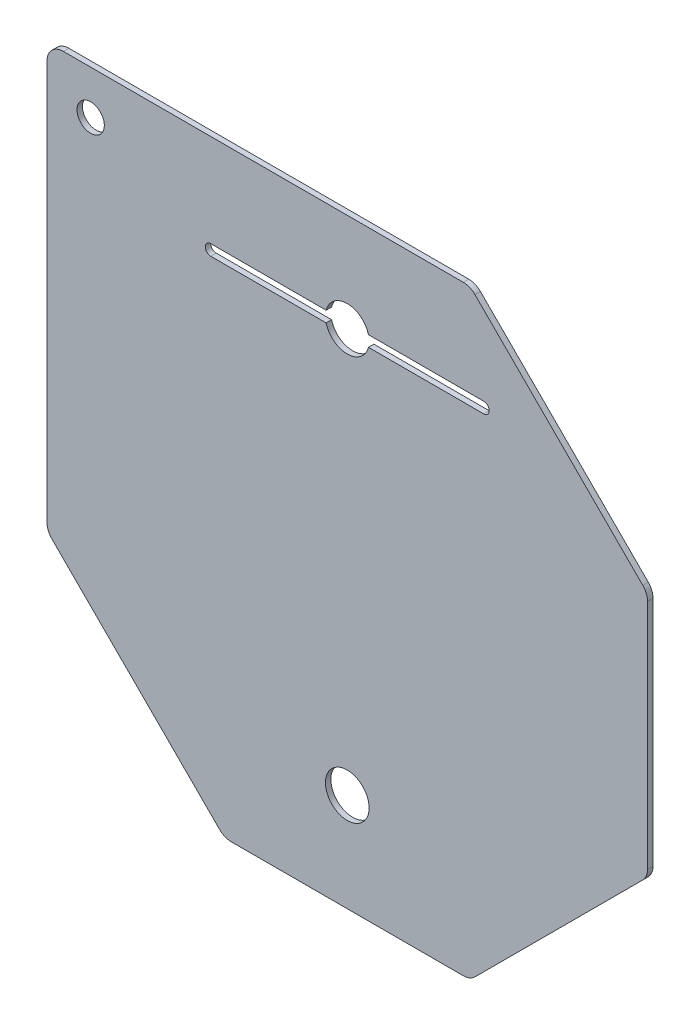
ISO-10303-21;
HEADER;
FILE_DESCRIPTION(('STEP AP214'),'2;1');
FILE_NAME('part.step','',(''),(''),'','','');
FILE_SCHEMA(('AUTOMOTIVE_DESIGN { 1 0 10303 214 1 1 1 1 }'));
ENDSEC;
DATA;
#1=APPLICATION_CONTEXT('core data for automotive mechanical design processes');
#2=APPLICATION_PROTOCOL_DEFINITION('international standard','automotive_design',2000,#1);
#3=PRODUCT_CONTEXT('',#1,'mechanical');
#4=PRODUCT('Part','Part','',(#3));
#5=PRODUCT_RELATED_PRODUCT_CATEGORY('part','',(#4));
#6=PRODUCT_DEFINITION_FORMATION('','',#4);
#7=PRODUCT_DEFINITION_CONTEXT('part definition',#1,'design');
#8=PRODUCT_DEFINITION('design','',#6,#7);
#9=PRODUCT_DEFINITION_SHAPE('','',#8);
#10=(LENGTH_UNIT() NAMED_UNIT(*) SI_UNIT(.MILLI.,.METRE.));
#11=(NAMED_UNIT(*) PLANE_ANGLE_UNIT() SI_UNIT($,.RADIAN.));
#12=(NAMED_UNIT(*) SI_UNIT($,.STERADIAN.) SOLID_ANGLE_UNIT());
#13=UNCERTAINTY_MEASURE_WITH_UNIT(LENGTH_MEASURE(1.E-05),#10,'distance_accuracy_value','');
#14=(GEOMETRIC_REPRESENTATION_CONTEXT(3) GLOBAL_UNCERTAINTY_ASSIGNED_CONTEXT((#13)) GLOBAL_UNIT_ASSIGNED_CONTEXT((#10,
#11,#12)) REPRESENTATION_CONTEXT('',''));
#15=CARTESIAN_POINT('',(0.,0.,0.));
#16=DIRECTION('',(0.,0.,1.));
#17=DIRECTION('',(1.,0.,0.));
#18=AXIS2_PLACEMENT_3D('',#15,#16,#17);
#19=CARTESIAN_POINT('',(-52.,52.,1.));
#20=DIRECTION('',(0.,0.,-1.));
#21=DIRECTION('',(-1.,0.,0.));
#22=AXIS2_PLACEMENT_3D('',#19,#20,#21);
#23=PLANE('',#22);
#24=CARTESIAN_POINT('',(-47.,47.,1.));
#25=DIRECTION('',(0.,0.,1.));
#26=DIRECTION('',(1.,0.,0.));
#27=AXIS2_PLACEMENT_3D('',#24,#25,#26);
#28=CIRCLE('',#27,2.5);
#29=CARTESIAN_POINT('',(-44.5,47.,1.));
#30=VERTEX_POINT('',#29);
#31=EDGE_CURVE('E250',#30,#30,#28,.T.);
#32=ORIENTED_EDGE('',*,*,#31,.F.);
#33=EDGE_LOOP('',(#32));
#34=FACE_BOUND('',#33,.T.);
#35=CARTESIAN_POINT('',(-52.,52.,1.));
#36=DIRECTION('',(0.,0.,1.));
#37=DIRECTION('',(-1.,0.,0.));
#38=AXIS2_PLACEMENT_3D('',#35,#36,#37);
#39=CIRCLE('',#38,3.);
#40=CARTESIAN_POINT('',(-52.,55.,1.));
#41=VERTEX_POINT('',#40);
#42=CARTESIAN_POINT('',(-55.,52.,1.));
#43=VERTEX_POINT('',#42);
#44=EDGE_CURVE('E256',#41,#43,#39,.T.);
#45=ORIENTED_EDGE('',*,*,#44,.T.);
#46=DIRECTION('',(0.,-1.,0.));
#47=VECTOR('',#46,1.);
#48=CARTESIAN_POINT('',(-55.,-21.2573593128807,1.));
#49=LINE('',#48,#47);
#50=CARTESIAN_POINT('',(-55.,-21.2573593128807,1.));
#51=VERTEX_POINT('',#50);
#52=EDGE_CURVE('E259',#43,#51,#49,.T.);
#53=ORIENTED_EDGE('',*,*,#52,.T.);
#54=CARTESIAN_POINT('',(-52.,-21.2573593128807,1.));
#55=DIRECTION('',(0.,0.,1.));
#56=DIRECTION('',(-1.,0.,0.));
#57=AXIS2_PLACEMENT_3D('',#54,#55,#56);
#58=CIRCLE('',#57,3.);
#59=CARTESIAN_POINT('',(-54.1213203435596,-23.3786796564404,1.));
#60=VERTEX_POINT('',#59);
#61=EDGE_CURVE('E262',#51,#60,#58,.T.);
#62=ORIENTED_EDGE('',*,*,#61,.T.);
#63=DIRECTION('',(0.707106781186548,-0.707106781186547,0.));
#64=VECTOR('',#63,1.);
#65=CARTESIAN_POINT('',(-54.1213203435596,-23.3786796564404,1.));
#66=LINE('',#65,#64);
#67=CARTESIAN_POINT('',(-23.3786796564404,-54.1213203435596,1.));
#68=VERTEX_POINT('',#67);
#69=EDGE_CURVE('E264',#60,#68,#66,.T.);
#70=ORIENTED_EDGE('',*,*,#69,.T.);
#71=CARTESIAN_POINT('',(-21.2573593128807,-52.,1.));
#72=DIRECTION('',(0.,0.,1.));
#73=DIRECTION('',(-1.,0.,0.));
#74=AXIS2_PLACEMENT_3D('',#71,#72,#73);
#75=CIRCLE('',#74,2.99999999999999);
#76=CARTESIAN_POINT('',(-21.2573593128807,-55.,1.));
#77=VERTEX_POINT('',#76);
#78=EDGE_CURVE('E266',#68,#77,#75,.T.);
#79=ORIENTED_EDGE('',*,*,#78,.T.);
#80=DIRECTION('',(1.,0.,0.));
#81=VECTOR('',#80,1.);
#82=CARTESIAN_POINT('',(-21.2573593128807,-55.,1.));
#83=LINE('',#82,#81);
#84=CARTESIAN_POINT('',(21.2573593128807,-55.,1.));
#85=VERTEX_POINT('',#84);
#86=EDGE_CURVE('E268',#77,#85,#83,.T.);
#87=ORIENTED_EDGE('',*,*,#86,.T.);
#88=CARTESIAN_POINT('',(21.2573593128807,-52.,1.));
#89=DIRECTION('',(0.,0.,1.));
#90=DIRECTION('',(-1.,0.,0.));
#91=AXIS2_PLACEMENT_3D('',#88,#89,#90);
#92=CIRCLE('',#91,3.);
#93=CARTESIAN_POINT('',(23.3786796564404,-54.1213203435596,1.));
#94=VERTEX_POINT('',#93);
#95=EDGE_CURVE('E270',#85,#94,#92,.T.);
#96=ORIENTED_EDGE('',*,*,#95,.T.);
#97=DIRECTION('',(0.707106781186548,0.707106781186547,0.));
#98=VECTOR('',#97,1.);
#99=CARTESIAN_POINT('',(23.3786796564404,-54.1213203435596,1.));
#100=LINE('',#99,#98);
#101=CARTESIAN_POINT('',(54.1213203435596,-23.3786796564404,1.));
#102=VERTEX_POINT('',#101);
#103=EDGE_CURVE('E272',#94,#102,#100,.T.);
#104=ORIENTED_EDGE('',*,*,#103,.T.);
#105=CARTESIAN_POINT('',(52.,-21.2573593128807,1.));
#106=DIRECTION('',(0.,0.,1.));
#107=DIRECTION('',(1.,0.,0.));
#108=AXIS2_PLACEMENT_3D('',#105,#106,#107);
#109=CIRCLE('',#108,3.);
#110=CARTESIAN_POINT('',(55.,-21.2573593128807,1.));
#111=VERTEX_POINT('',#110);
#112=EDGE_CURVE('E274',#102,#111,#109,.T.);
#113=ORIENTED_EDGE('',*,*,#112,.T.);
#114=DIRECTION('',(0.,1.,0.));
#115=VECTOR('',#114,1.);
#116=CARTESIAN_POINT('',(55.,-21.2573593128807,1.));
#117=LINE('',#116,#115);
#118=CARTESIAN_POINT('',(55.,21.2573593128807,1.));
#119=VERTEX_POINT('',#118);
#120=EDGE_CURVE('E276',#111,#119,#117,.T.);
#121=ORIENTED_EDGE('',*,*,#120,.T.);
#122=CARTESIAN_POINT('',(52.,21.2573593128807,1.));
#123=DIRECTION('',(0.,0.,1.));
#124=DIRECTION('',(-1.,0.,0.));
#125=AXIS2_PLACEMENT_3D('',#122,#123,#124);
#126=CIRCLE('',#125,3.);
#127=CARTESIAN_POINT('',(54.1213203435596,23.3786796564404,1.));
#128=VERTEX_POINT('',#127);
#129=EDGE_CURVE('E278',#119,#128,#126,.T.);
#130=ORIENTED_EDGE('',*,*,#129,.T.);
#131=DIRECTION('',(-0.707106781186548,0.707106781186547,0.));
#132=VECTOR('',#131,1.);
#133=CARTESIAN_POINT('',(54.1213203435596,23.3786796564404,1.));
#134=LINE('',#133,#132);
#135=CARTESIAN_POINT('',(23.3786796564404,54.1213203435596,1.));
#136=VERTEX_POINT('',#135);
#137=EDGE_CURVE('E280',#128,#136,#134,.T.);
#138=ORIENTED_EDGE('',*,*,#137,.T.);
#139=CARTESIAN_POINT('',(21.2573593128807,52.,1.));
#140=DIRECTION('',(0.,0.,1.));
#141=DIRECTION('',(-1.,0.,0.));
#142=AXIS2_PLACEMENT_3D('',#139,#140,#141);
#143=CIRCLE('',#142,3.);
#144=CARTESIAN_POINT('',(21.2573593128807,55.,1.));
#145=VERTEX_POINT('',#144);
#146=EDGE_CURVE('E282',#136,#145,#143,.T.);
#147=ORIENTED_EDGE('',*,*,#146,.T.);
#148=DIRECTION('',(-1.,0.,0.));
#149=VECTOR('',#148,1.);
#150=CARTESIAN_POINT('',(-52.,55.,1.));
#151=LINE('',#150,#149);
#152=EDGE_CURVE('E284',#145,#41,#151,.T.);
#153=ORIENTED_EDGE('',*,*,#152,.T.);
#154=EDGE_LOOP('',(#45,#53,#62,#70,#79,#87,#96,#104,#113,#121,#130,#138,#147,#153));
#155=FACE_BOUND('',#154,.T.);
#156=CARTESIAN_POINT('',(0.,37.,1.));
#157=DIRECTION('',(0.,0.,1.));
#158=DIRECTION('',(1.,0.,0.));
#159=AXIS2_PLACEMENT_3D('',#156,#157,#158);
#160=CIRCLE('',#159,4.);
#161=CARTESIAN_POINT('',(-3.87298334620742,36.,1.));
#162=VERTEX_POINT('',#161);
#163=CARTESIAN_POINT('',(3.87298334620742,36.,1.));
#164=VERTEX_POINT('',#163);
#165=EDGE_CURVE('E182',#162,#164,#160,.T.);
#166=ORIENTED_EDGE('',*,*,#165,.F.);
#167=DIRECTION('',(1.,0.,0.));
#168=VECTOR('',#167,1.);
#169=CARTESIAN_POINT('',(-25.,36.,1.));
#170=LINE('',#169,#168);
#171=CARTESIAN_POINT('',(-25.,36.,1.));
#172=VERTEX_POINT('',#171);
#173=EDGE_CURVE('E217',#172,#162,#170,.T.);
#174=ORIENTED_EDGE('',*,*,#173,.F.);
#175=CARTESIAN_POINT('',(-25.,37.,1.));
#176=DIRECTION('',(0.,0.,1.));
#177=DIRECTION('',(1.,0.,0.));
#178=AXIS2_PLACEMENT_3D('',#175,#176,#177);
#179=CIRCLE('',#178,0.999999999999994);
#180=CARTESIAN_POINT('',(-25.,38.,1.));
#181=VERTEX_POINT('',#180);
#182=EDGE_CURVE('E215',#181,#172,#179,.T.);
#183=ORIENTED_EDGE('',*,*,#182,.F.);
#184=DIRECTION('',(-1.,0.,0.));
#185=VECTOR('',#184,1.);
#186=CARTESIAN_POINT('',(-25.,38.,1.));
#187=LINE('',#186,#185);
#188=CARTESIAN_POINT('',(-3.87298334620742,38.,1.));
#189=VERTEX_POINT('',#188);
#190=EDGE_CURVE('E213',#189,#181,#187,.T.);
#191=ORIENTED_EDGE('',*,*,#190,.F.);
#192=CARTESIAN_POINT('',(0.,37.,1.));
#193=DIRECTION('',(0.,0.,1.));
#194=DIRECTION('',(1.,0.,0.));
#195=AXIS2_PLACEMENT_3D('',#192,#193,#194);
#196=CIRCLE('',#195,4.);
#197=CARTESIAN_POINT('',(3.87298334620742,38.,1.));
#198=VERTEX_POINT('',#197);
#199=EDGE_CURVE('E211',#198,#189,#196,.T.);
#200=ORIENTED_EDGE('',*,*,#199,.F.);
#201=DIRECTION('',(-1.,0.,0.));
#202=VECTOR('',#201,1.);
#203=CARTESIAN_POINT('',(3.87298334620742,38.,1.));
#204=LINE('',#203,#202);
#205=CARTESIAN_POINT('',(25.,38.,1.));
#206=VERTEX_POINT('',#205);
#207=EDGE_CURVE('E206',#206,#198,#204,.T.);
#208=ORIENTED_EDGE('',*,*,#207,.F.);
#209=CARTESIAN_POINT('',(25.,37.,1.));
#210=DIRECTION('',(0.,0.,1.));
#211=DIRECTION('',(1.,0.,0.));
#212=AXIS2_PLACEMENT_3D('',#209,#210,#211);
#213=CIRCLE('',#212,0.999999999999994);
#214=CARTESIAN_POINT('',(25.,36.,1.));
#215=VERTEX_POINT('',#214);
#216=EDGE_CURVE('E204',#215,#206,#213,.T.);
#217=ORIENTED_EDGE('',*,*,#216,.F.);
#218=DIRECTION('',(1.,0.,0.));
#219=VECTOR('',#218,1.);
#220=CARTESIAN_POINT('',(3.87298334620742,36.,1.));
#221=LINE('',#220,#219);
#222=EDGE_CURVE('E190',#164,#215,#221,.T.);
#223=ORIENTED_EDGE('',*,*,#222,.F.);
#224=EDGE_LOOP('',(#166,#174,#183,#191,#200,#208,#217,#223));
#225=FACE_BOUND('',#224,.T.);
#226=CARTESIAN_POINT('',(0.,-37.,1.));
#227=DIRECTION('',(0.,0.,1.));
#228=DIRECTION('',(1.,0.,0.));
#229=AXIS2_PLACEMENT_3D('',#226,#227,#228);
#230=CIRCLE('',#229,4.);
#231=CARTESIAN_POINT('',(4.,-37.,1.));
#232=VERTEX_POINT('',#231);
#233=EDGE_CURVE('E220',#232,#232,#230,.T.);
#234=ORIENTED_EDGE('',*,*,#233,.F.);
#235=EDGE_LOOP('',(#234));
#236=FACE_BOUND('',#235,.T.);
#237=ADVANCED_FACE('F33',(#34,#155,#225,#236),#23,.F.);
#238=CARTESIAN_POINT('',(-52.,52.,0.));
#239=DIRECTION('',(0.,0.,-1.));
#240=DIRECTION('',(-1.,0.,0.));
#241=AXIS2_PLACEMENT_3D('',#238,#239,#240);
#242=PLANE('',#241);
#243=DIRECTION('',(1.,0.,0.));
#244=VECTOR('',#243,1.);
#245=CARTESIAN_POINT('',(-25.,36.,0.));
#246=LINE('',#245,#244);
#247=CARTESIAN_POINT('',(-25.,36.,0.));
#248=VERTEX_POINT('',#247);
#249=CARTESIAN_POINT('',(-3.87298334620742,36.,0.));
#250=VERTEX_POINT('',#249);
#251=EDGE_CURVE('E191',#248,#250,#246,.T.);
#252=ORIENTED_EDGE('',*,*,#251,.T.);
#253=CARTESIAN_POINT('',(0.,37.,0.));
#254=DIRECTION('',(0.,0.,1.));
#255=DIRECTION('',(1.,0.,0.));
#256=AXIS2_PLACEMENT_3D('',#253,#254,#255);
#257=CIRCLE('',#256,4.);
#258=CARTESIAN_POINT('',(3.87298334620742,36.,0.));
#259=VERTEX_POINT('',#258);
#260=EDGE_CURVE('E56',#250,#259,#257,.T.);
#261=ORIENTED_EDGE('',*,*,#260,.T.);
#262=DIRECTION('',(1.,0.,0.));
#263=VECTOR('',#262,1.);
#264=CARTESIAN_POINT('',(3.87298334620742,36.,0.));
#265=LINE('',#264,#263);
#266=CARTESIAN_POINT('',(25.,36.,0.));
#267=VERTEX_POINT('',#266);
#268=EDGE_CURVE('E197',#259,#267,#265,.T.);
#269=ORIENTED_EDGE('',*,*,#268,.T.);
#270=CARTESIAN_POINT('',(25.,37.,0.));
#271=DIRECTION('',(0.,0.,1.));
#272=DIRECTION('',(1.,0.,0.));
#273=AXIS2_PLACEMENT_3D('',#270,#271,#272);
#274=CIRCLE('',#273,0.999999999999994);
#275=CARTESIAN_POINT('',(25.,38.,0.));
#276=VERTEX_POINT('',#275);
#277=EDGE_CURVE('E222',#267,#276,#274,.T.);
#278=ORIENTED_EDGE('',*,*,#277,.T.);
#279=DIRECTION('',(-1.,0.,0.));
#280=VECTOR('',#279,1.);
#281=CARTESIAN_POINT('',(3.87298334620742,38.,0.));
#282=LINE('',#281,#280);
#283=CARTESIAN_POINT('',(3.87298334620742,38.,0.));
#284=VERTEX_POINT('',#283);
#285=EDGE_CURVE('E225',#276,#284,#282,.T.);
#286=ORIENTED_EDGE('',*,*,#285,.T.);
#287=CARTESIAN_POINT('',(0.,37.,0.));
#288=DIRECTION('',(0.,0.,1.));
#289=DIRECTION('',(1.,0.,0.));
#290=AXIS2_PLACEMENT_3D('',#287,#288,#289);
#291=CIRCLE('',#290,4.);
#292=CARTESIAN_POINT('',(-3.87298334620742,38.,0.));
#293=VERTEX_POINT('',#292);
#294=EDGE_CURVE('E228',#284,#293,#291,.T.);
#295=ORIENTED_EDGE('',*,*,#294,.T.);
#296=DIRECTION('',(-1.,0.,0.));
#297=VECTOR('',#296,1.);
#298=CARTESIAN_POINT('',(-25.,38.,0.));
#299=LINE('',#298,#297);
#300=CARTESIAN_POINT('',(-25.,38.,0.));
#301=VERTEX_POINT('',#300);
#302=EDGE_CURVE('E231',#293,#301,#299,.T.);
#303=ORIENTED_EDGE('',*,*,#302,.T.);
#304=CARTESIAN_POINT('',(-25.,37.,0.));
#305=DIRECTION('',(0.,0.,1.));
#306=DIRECTION('',(1.,0.,0.));
#307=AXIS2_PLACEMENT_3D('',#304,#305,#306);
#308=CIRCLE('',#307,0.999999999999994);
#309=EDGE_CURVE('E234',#301,#248,#308,.T.);
#310=ORIENTED_EDGE('',*,*,#309,.T.);
#311=EDGE_LOOP('',(#252,#261,#269,#278,#286,#295,#303,#310));
#312=FACE_BOUND('',#311,.T.);
#313=CARTESIAN_POINT('',(-47.,47.,0.));
#314=DIRECTION('',(0.,0.,1.));
#315=DIRECTION('',(1.,0.,0.));
#316=AXIS2_PLACEMENT_3D('',#313,#314,#315);
#317=CIRCLE('',#316,2.5);
#318=CARTESIAN_POINT('',(-44.5,47.,0.));
#319=VERTEX_POINT('',#318);
#320=EDGE_CURVE('E198',#319,#319,#317,.T.);
#321=ORIENTED_EDGE('',*,*,#320,.T.);
#322=EDGE_LOOP('',(#321));
#323=FACE_BOUND('',#322,.T.);
#324=CARTESIAN_POINT('',(-52.,52.,0.));
#325=DIRECTION('',(0.,0.,1.));
#326=DIRECTION('',(-1.,0.,0.));
#327=AXIS2_PLACEMENT_3D('',#324,#325,#326);
#328=CIRCLE('',#327,3.);
#329=CARTESIAN_POINT('',(-52.,55.,0.));
#330=VERTEX_POINT('',#329);
#331=CARTESIAN_POINT('',(-55.,52.,0.));
#332=VERTEX_POINT('',#331);
#333=EDGE_CURVE('E253',#330,#332,#328,.T.);
#334=ORIENTED_EDGE('',*,*,#333,.F.);
#335=DIRECTION('',(-1.,0.,0.));
#336=VECTOR('',#335,1.);
#337=CARTESIAN_POINT('',(-52.,55.,0.));
#338=LINE('',#337,#336);
#339=CARTESIAN_POINT('',(21.2573593128807,55.,0.));
#340=VERTEX_POINT('',#339);
#341=EDGE_CURVE('E260',#340,#330,#338,.T.);
#342=ORIENTED_EDGE('',*,*,#341,.F.);
#343=CARTESIAN_POINT('',(21.2573593128807,52.,0.));
#344=DIRECTION('',(0.,0.,1.));
#345=DIRECTION('',(-1.,0.,0.));
#346=AXIS2_PLACEMENT_3D('',#343,#344,#345);
#347=CIRCLE('',#346,3.);
#348=CARTESIAN_POINT('',(23.3786796564404,54.1213203435596,0.));
#349=VERTEX_POINT('',#348);
#350=EDGE_CURVE('E311',#349,#340,#347,.T.);
#351=ORIENTED_EDGE('',*,*,#350,.F.);
#352=DIRECTION('',(-0.707106781186548,0.707106781186547,0.));
#353=VECTOR('',#352,1.);
#354=CARTESIAN_POINT('',(54.1213203435596,23.3786796564404,0.));
#355=LINE('',#354,#353);
#356=CARTESIAN_POINT('',(54.1213203435596,23.3786796564404,0.));
#357=VERTEX_POINT('',#356);
#358=EDGE_CURVE('E309',#357,#349,#355,.T.);
#359=ORIENTED_EDGE('',*,*,#358,.F.);
#360=CARTESIAN_POINT('',(52.,21.2573593128807,0.));
#361=DIRECTION('',(0.,0.,1.));
#362=DIRECTION('',(-1.,0.,0.));
#363=AXIS2_PLACEMENT_3D('',#360,#361,#362);
#364=CIRCLE('',#363,3.);
#365=CARTESIAN_POINT('',(55.,21.2573593128807,0.));
#366=VERTEX_POINT('',#365);
#367=EDGE_CURVE('E307',#366,#357,#364,.T.);
#368=ORIENTED_EDGE('',*,*,#367,.F.);
#369=DIRECTION('',(0.,1.,0.));
#370=VECTOR('',#369,1.);
#371=CARTESIAN_POINT('',(55.,-21.2573593128807,0.));
#372=LINE('',#371,#370);
#373=CARTESIAN_POINT('',(55.,-21.2573593128807,0.));
#374=VERTEX_POINT('',#373);
#375=EDGE_CURVE('E305',#374,#366,#372,.T.);
#376=ORIENTED_EDGE('',*,*,#375,.F.);
#377=CARTESIAN_POINT('',(52.,-21.2573593128807,0.));
#378=DIRECTION('',(0.,0.,1.));
#379=DIRECTION('',(1.,0.,0.));
#380=AXIS2_PLACEMENT_3D('',#377,#378,#379);
#381=CIRCLE('',#380,3.);
#382=CARTESIAN_POINT('',(54.1213203435596,-23.3786796564404,0.));
#383=VERTEX_POINT('',#382);
#384=EDGE_CURVE('E303',#383,#374,#381,.T.);
#385=ORIENTED_EDGE('',*,*,#384,.F.);
#386=DIRECTION('',(0.707106781186548,0.707106781186547,0.));
#387=VECTOR('',#386,1.);
#388=CARTESIAN_POINT('',(23.3786796564404,-54.1213203435596,0.));
#389=LINE('',#388,#387);
#390=CARTESIAN_POINT('',(23.3786796564404,-54.1213203435596,0.));
#391=VERTEX_POINT('',#390);
#392=EDGE_CURVE('E301',#391,#383,#389,.T.);
#393=ORIENTED_EDGE('',*,*,#392,.F.);
#394=CARTESIAN_POINT('',(21.2573593128807,-52.,0.));
#395=DIRECTION('',(0.,0.,1.));
#396=DIRECTION('',(-1.,0.,0.));
#397=AXIS2_PLACEMENT_3D('',#394,#395,#396);
#398=CIRCLE('',#397,3.);
#399=CARTESIAN_POINT('',(21.2573593128807,-55.,0.));
#400=VERTEX_POINT('',#399);
#401=EDGE_CURVE('E299',#400,#391,#398,.T.);
#402=ORIENTED_EDGE('',*,*,#401,.F.);
#403=DIRECTION('',(1.,0.,0.));
#404=VECTOR('',#403,1.);
#405=CARTESIAN_POINT('',(-21.2573593128807,-55.,0.));
#406=LINE('',#405,#404);
#407=CARTESIAN_POINT('',(-21.2573593128807,-55.,0.));
#408=VERTEX_POINT('',#407);
#409=EDGE_CURVE('E297',#408,#400,#406,.T.);
#410=ORIENTED_EDGE('',*,*,#409,.F.);
#411=CARTESIAN_POINT('',(-21.2573593128807,-52.,0.));
#412=DIRECTION('',(0.,0.,1.));
#413=DIRECTION('',(-1.,0.,0.));
#414=AXIS2_PLACEMENT_3D('',#411,#412,#413);
#415=CIRCLE('',#414,2.99999999999999);
#416=CARTESIAN_POINT('',(-23.3786796564404,-54.1213203435596,0.));
#417=VERTEX_POINT('',#416);
#418=EDGE_CURVE('E295',#417,#408,#415,.T.);
#419=ORIENTED_EDGE('',*,*,#418,.F.);
#420=DIRECTION('',(0.707106781186548,-0.707106781186547,0.));
#421=VECTOR('',#420,1.);
#422=CARTESIAN_POINT('',(-54.1213203435596,-23.3786796564404,0.));
#423=LINE('',#422,#421);
#424=CARTESIAN_POINT('',(-54.1213203435596,-23.3786796564404,0.));
#425=VERTEX_POINT('',#424);
#426=EDGE_CURVE('E293',#425,#417,#423,.T.);
#427=ORIENTED_EDGE('',*,*,#426,.F.);
#428=CARTESIAN_POINT('',(-52.,-21.2573593128807,0.));
#429=DIRECTION('',(0.,0.,1.));
#430=DIRECTION('',(-1.,0.,0.));
#431=AXIS2_PLACEMENT_3D('',#428,#429,#430);
#432=CIRCLE('',#431,3.);
#433=CARTESIAN_POINT('',(-55.,-21.2573593128807,0.));
#434=VERTEX_POINT('',#433);
#435=EDGE_CURVE('E291',#434,#425,#432,.T.);
#436=ORIENTED_EDGE('',*,*,#435,.F.);
#437=DIRECTION('',(0.,-1.,0.));
#438=VECTOR('',#437,1.);
#439=CARTESIAN_POINT('',(-55.,-21.2573593128807,0.));
#440=LINE('',#439,#438);
#441=EDGE_CURVE('E289',#332,#434,#440,.T.);
#442=ORIENTED_EDGE('',*,*,#441,.F.);
#443=EDGE_LOOP('',(#334,#342,#351,#359,#368,#376,#385,#393,#402,#410,#419,#427,#436,#442));
#444=FACE_BOUND('',#443,.T.);
#445=CARTESIAN_POINT('',(0.,-37.,0.));
#446=DIRECTION('',(0.,0.,1.));
#447=DIRECTION('',(1.,0.,0.));
#448=AXIS2_PLACEMENT_3D('',#445,#446,#447);
#449=CIRCLE('',#448,4.);
#450=CARTESIAN_POINT('',(4.,-37.,0.));
#451=VERTEX_POINT('',#450);
#452=EDGE_CURVE('E649',#451,#451,#449,.T.);
#453=ORIENTED_EDGE('',*,*,#452,.T.);
#454=EDGE_LOOP('',(#453));
#455=FACE_BOUND('',#454,.T.);
#456=ADVANCED_FACE('F359',(#312,#323,#444,#455),#242,.T.);
#457=CARTESIAN_POINT('',(-52.,52.,1.));
#458=DIRECTION('',(0.,0.,-1.));
#459=DIRECTION('',(-1.,0.,0.));
#460=AXIS2_PLACEMENT_3D('',#457,#458,#459);
#461=CYLINDRICAL_SURFACE('',#460,3.);
#462=ORIENTED_EDGE('',*,*,#333,.T.);
#463=DIRECTION('',(0.,0.,-1.));
#464=VECTOR('',#463,1.);
#465=CARTESIAN_POINT('',(-55.,52.,1.));
#466=LINE('',#465,#464);
#467=EDGE_CURVE('E11',#43,#332,#466,.T.);
#468=ORIENTED_EDGE('',*,*,#467,.F.);
#469=ORIENTED_EDGE('',*,*,#44,.F.);
#470=DIRECTION('',(0.,0.,-1.));
#471=VECTOR('',#470,1.);
#472=CARTESIAN_POINT('',(-52.,55.,1.));
#473=LINE('',#472,#471);
#474=EDGE_CURVE('E286',#41,#330,#473,.T.);
#475=ORIENTED_EDGE('',*,*,#474,.T.);
#476=EDGE_LOOP('',(#462,#468,#469,#475));
#477=FACE_BOUND('',#476,.T.);
#478=ADVANCED_FACE('F35',(#477),#461,.T.);
#479=CARTESIAN_POINT('',(-55.,-21.2573593128807,1.));
#480=DIRECTION('',(1.,0.,0.));
#481=DIRECTION('',(0.,1.,0.));
#482=AXIS2_PLACEMENT_3D('',#479,#480,#481);
#483=PLANE('',#482);
#484=ORIENTED_EDGE('',*,*,#441,.T.);
#485=DIRECTION('',(0.,0.,-1.));
#486=VECTOR('',#485,1.);
#487=CARTESIAN_POINT('',(-55.,-21.2573593128807,1.));
#488=LINE('',#487,#486);
#489=EDGE_CURVE('E41',#51,#434,#488,.T.);
#490=ORIENTED_EDGE('',*,*,#489,.F.);
#491=ORIENTED_EDGE('',*,*,#52,.F.);
#492=ORIENTED_EDGE('',*,*,#467,.T.);
#493=EDGE_LOOP('',(#484,#490,#491,#492));
#494=FACE_BOUND('',#493,.T.);
#495=ADVANCED_FACE('F376',(#494),#483,.F.);
#496=CARTESIAN_POINT('',(-52.,-21.2573593128807,1.));
#497=DIRECTION('',(0.,0.,-1.));
#498=DIRECTION('',(-1.,0.,0.));
#499=AXIS2_PLACEMENT_3D('',#496,#497,#498);
#500=CYLINDRICAL_SURFACE('',#499,3.);
#501=ORIENTED_EDGE('',*,*,#435,.T.);
#502=DIRECTION('',(0.,0.,-1.));
#503=VECTOR('',#502,1.);
#504=CARTESIAN_POINT('',(-54.1213203435596,-23.3786796564404,1.));
#505=LINE('',#504,#503);
#506=EDGE_CURVE('E346',#60,#425,#505,.T.);
#507=ORIENTED_EDGE('',*,*,#506,.F.);
#508=ORIENTED_EDGE('',*,*,#61,.F.);
#509=ORIENTED_EDGE('',*,*,#489,.T.);
#510=EDGE_LOOP('',(#501,#507,#508,#509));
#511=FACE_BOUND('',#510,.T.);
#512=ADVANCED_FACE('F353',(#511),#500,.T.);
#513=CARTESIAN_POINT('',(-54.1213203435596,-23.3786796564404,1.));
#514=DIRECTION('',(0.707106781186547,0.707106781186548,0.));
#515=DIRECTION('',(-0.707106781186548,0.707106781186547,0.));
#516=AXIS2_PLACEMENT_3D('',#513,#514,#515);
#517=PLANE('',#516);
#518=ORIENTED_EDGE('',*,*,#426,.T.);
#519=DIRECTION('',(0.,0.,-1.));
#520=VECTOR('',#519,1.);
#521=CARTESIAN_POINT('',(-23.3786796564404,-54.1213203435596,1.));
#522=LINE('',#521,#520);
#523=EDGE_CURVE('E343',#68,#417,#522,.T.);
#524=ORIENTED_EDGE('',*,*,#523,.F.);
#525=ORIENTED_EDGE('',*,*,#69,.F.);
#526=ORIENTED_EDGE('',*,*,#506,.T.);
#527=EDGE_LOOP('',(#518,#524,#525,#526));
#528=FACE_BOUND('',#527,.T.);
#529=ADVANCED_FACE('F365',(#528),#517,.F.);
#530=CARTESIAN_POINT('',(-21.2573593128807,-52.,1.));
#531=DIRECTION('',(0.,0.,-1.));
#532=DIRECTION('',(-1.,0.,0.));
#533=AXIS2_PLACEMENT_3D('',#530,#531,#532);
#534=CYLINDRICAL_SURFACE('',#533,2.99999999999999);
#535=ORIENTED_EDGE('',*,*,#418,.T.);
#536=DIRECTION('',(0.,0.,-1.));
#537=VECTOR('',#536,1.);
#538=CARTESIAN_POINT('',(-21.2573593128807,-55.,1.));
#539=LINE('',#538,#537);
#540=EDGE_CURVE('E340',#77,#408,#539,.T.);
#541=ORIENTED_EDGE('',*,*,#540,.F.);
#542=ORIENTED_EDGE('',*,*,#78,.F.);
#543=ORIENTED_EDGE('',*,*,#523,.T.);
#544=EDGE_LOOP('',(#535,#541,#542,#543));
#545=FACE_BOUND('',#544,.T.);
#546=ADVANCED_FACE('F369',(#545),#534,.T.);
#547=CARTESIAN_POINT('',(-21.2573593128807,-55.,1.));
#548=DIRECTION('',(0.,1.,0.));
#549=DIRECTION('',(0.,0.,1.));
#550=AXIS2_PLACEMENT_3D('',#547,#548,#549);
#551=PLANE('',#550);
#552=ORIENTED_EDGE('',*,*,#409,.T.);
#553=DIRECTION('',(0.,0.,-1.));
#554=VECTOR('',#553,1.);
#555=CARTESIAN_POINT('',(21.2573593128807,-55.,1.));
#556=LINE('',#555,#554);
#557=EDGE_CURVE('E337',#85,#400,#556,.T.);
#558=ORIENTED_EDGE('',*,*,#557,.F.);
#559=ORIENTED_EDGE('',*,*,#86,.F.);
#560=ORIENTED_EDGE('',*,*,#540,.T.);
#561=EDGE_LOOP('',(#552,#558,#559,#560));
#562=FACE_BOUND('',#561,.T.);
#563=ADVANCED_FACE('F419',(#562),#551,.F.);
#564=CARTESIAN_POINT('',(21.2573593128807,-52.,1.));
#565=DIRECTION('',(0.,0.,-1.));
#566=DIRECTION('',(-1.,0.,0.));
#567=AXIS2_PLACEMENT_3D('',#564,#565,#566);
#568=CYLINDRICAL_SURFACE('',#567,3.);
#569=ORIENTED_EDGE('',*,*,#401,.T.);
#570=DIRECTION('',(0.,0.,-1.));
#571=VECTOR('',#570,1.);
#572=CARTESIAN_POINT('',(23.3786796564404,-54.1213203435596,1.));
#573=LINE('',#572,#571);
#574=EDGE_CURVE('E334',#94,#391,#573,.T.);
#575=ORIENTED_EDGE('',*,*,#574,.F.);
#576=ORIENTED_EDGE('',*,*,#95,.F.);
#577=ORIENTED_EDGE('',*,*,#557,.T.);
#578=EDGE_LOOP('',(#569,#575,#576,#577));
#579=FACE_BOUND('',#578,.T.);
#580=ADVANCED_FACE('F417',(#579),#568,.T.);
#581=CARTESIAN_POINT('',(23.3786796564404,-54.1213203435596,1.));
#582=DIRECTION('',(-0.707106781186547,0.707106781186548,0.));
#583=DIRECTION('',(-0.707106781186548,-0.707106781186547,0.));
#584=AXIS2_PLACEMENT_3D('',#581,#582,#583);
#585=PLANE('',#584);
#586=ORIENTED_EDGE('',*,*,#392,.T.);
#587=DIRECTION('',(0.,0.,-1.));
#588=VECTOR('',#587,1.);
#589=CARTESIAN_POINT('',(54.1213203435596,-23.3786796564404,1.));
#590=LINE('',#589,#588);
#591=EDGE_CURVE('E331',#102,#383,#590,.T.);
#592=ORIENTED_EDGE('',*,*,#591,.F.);
#593=ORIENTED_EDGE('',*,*,#103,.F.);
#594=ORIENTED_EDGE('',*,*,#574,.T.);
#595=EDGE_LOOP('',(#586,#592,#593,#594));
#596=FACE_BOUND('',#595,.T.);
#597=ADVANCED_FACE('F412',(#596),#585,.F.);
#598=CARTESIAN_POINT('',(52.,-21.2573593128807,1.));
#599=DIRECTION('',(0.,0.,-1.));
#600=DIRECTION('',(-1.,0.,0.));
#601=AXIS2_PLACEMENT_3D('',#598,#599,#600);
#602=CYLINDRICAL_SURFACE('',#601,3.);
#603=ORIENTED_EDGE('',*,*,#384,.T.);
#604=DIRECTION('',(0.,0.,-1.));
#605=VECTOR('',#604,1.);
#606=CARTESIAN_POINT('',(55.,-21.2573593128807,1.));
#607=LINE('',#606,#605);
#608=EDGE_CURVE('E328',#111,#374,#607,.T.);
#609=ORIENTED_EDGE('',*,*,#608,.F.);
#610=ORIENTED_EDGE('',*,*,#112,.F.);
#611=ORIENTED_EDGE('',*,*,#591,.T.);
#612=EDGE_LOOP('',(#603,#609,#610,#611));
#613=FACE_BOUND('',#612,.T.);
#614=ADVANCED_FACE('F407',(#613),#602,.T.);
#615=CARTESIAN_POINT('',(55.,-21.2573593128807,1.));
#616=DIRECTION('',(-1.,0.,0.));
#617=DIRECTION('',(0.,0.,1.));
#618=AXIS2_PLACEMENT_3D('',#615,#616,#617);
#619=PLANE('',#618);
#620=ORIENTED_EDGE('',*,*,#375,.T.);
#621=DIRECTION('',(0.,0.,-1.));
#622=VECTOR('',#621,1.);
#623=CARTESIAN_POINT('',(55.,21.2573593128807,1.));
#624=LINE('',#623,#622);
#625=EDGE_CURVE('E325',#119,#366,#624,.T.);
#626=ORIENTED_EDGE('',*,*,#625,.F.);
#627=ORIENTED_EDGE('',*,*,#120,.F.);
#628=ORIENTED_EDGE('',*,*,#608,.T.);
#629=EDGE_LOOP('',(#620,#626,#627,#628));
#630=FACE_BOUND('',#629,.T.);
#631=ADVANCED_FACE('F403',(#630),#619,.F.);
#632=CARTESIAN_POINT('',(52.,21.2573593128807,1.));
#633=DIRECTION('',(0.,0.,-1.));
#634=DIRECTION('',(-1.,0.,0.));
#635=AXIS2_PLACEMENT_3D('',#632,#633,#634);
#636=CYLINDRICAL_SURFACE('',#635,3.);
#637=ORIENTED_EDGE('',*,*,#367,.T.);
#638=DIRECTION('',(0.,0.,-1.));
#639=VECTOR('',#638,1.);
#640=CARTESIAN_POINT('',(54.1213203435596,23.3786796564404,1.));
#641=LINE('',#640,#639);
#642=EDGE_CURVE('E322',#128,#357,#641,.T.);
#643=ORIENTED_EDGE('',*,*,#642,.F.);
#644=ORIENTED_EDGE('',*,*,#129,.F.);
#645=ORIENTED_EDGE('',*,*,#625,.T.);
#646=EDGE_LOOP('',(#637,#643,#644,#645));
#647=FACE_BOUND('',#646,.T.);
#648=ADVANCED_FACE('F398',(#647),#636,.T.);
#649=CARTESIAN_POINT('',(54.1213203435596,23.3786796564404,1.));
#650=DIRECTION('',(-0.707106781186547,-0.707106781186548,0.));
#651=DIRECTION('',(0.707106781186548,-0.707106781186547,0.));
#652=AXIS2_PLACEMENT_3D('',#649,#650,#651);
#653=PLANE('',#652);
#654=ORIENTED_EDGE('',*,*,#358,.T.);
#655=DIRECTION('',(0.,0.,-1.));
#656=VECTOR('',#655,1.);
#657=CARTESIAN_POINT('',(23.3786796564404,54.1213203435596,1.));
#658=LINE('',#657,#656);
#659=EDGE_CURVE('E319',#136,#349,#658,.T.);
#660=ORIENTED_EDGE('',*,*,#659,.F.);
#661=ORIENTED_EDGE('',*,*,#137,.F.);
#662=ORIENTED_EDGE('',*,*,#642,.T.);
#663=EDGE_LOOP('',(#654,#660,#661,#662));
#664=FACE_BOUND('',#663,.T.);
#665=ADVANCED_FACE('F392',(#664),#653,.F.);
#666=CARTESIAN_POINT('',(21.2573593128807,52.,1.));
#667=DIRECTION('',(0.,0.,-1.));
#668=DIRECTION('',(-1.,0.,0.));
#669=AXIS2_PLACEMENT_3D('',#666,#667,#668);
#670=CYLINDRICAL_SURFACE('',#669,3.);
#671=ORIENTED_EDGE('',*,*,#350,.T.);
#672=DIRECTION('',(0.,0.,-1.));
#673=VECTOR('',#672,1.);
#674=CARTESIAN_POINT('',(21.2573593128807,55.,1.));
#675=LINE('',#674,#673);
#676=EDGE_CURVE('E316',#145,#340,#675,.T.);
#677=ORIENTED_EDGE('',*,*,#676,.F.);
#678=ORIENTED_EDGE('',*,*,#146,.F.);
#679=ORIENTED_EDGE('',*,*,#659,.T.);
#680=EDGE_LOOP('',(#671,#677,#678,#679));
#681=FACE_BOUND('',#680,.T.);
#682=ADVANCED_FACE('F388',(#681),#670,.T.);
#683=CARTESIAN_POINT('',(-52.,55.,1.));
#684=DIRECTION('',(0.,-1.,0.));
#685=DIRECTION('',(0.,0.,-1.));
#686=AXIS2_PLACEMENT_3D('',#683,#684,#685);
#687=PLANE('',#686);
#688=ORIENTED_EDGE('',*,*,#341,.T.);
#689=ORIENTED_EDGE('',*,*,#474,.F.);
#690=ORIENTED_EDGE('',*,*,#152,.F.);
#691=ORIENTED_EDGE('',*,*,#676,.T.);
#692=EDGE_LOOP('',(#688,#689,#690,#691));
#693=FACE_BOUND('',#692,.T.);
#694=ADVANCED_FACE('F383',(#693),#687,.F.);
#695=CARTESIAN_POINT('',(-47.,47.,1.));
#696=DIRECTION('',(0.,0.,-1.));
#697=DIRECTION('',(-1.,0.,0.));
#698=AXIS2_PLACEMENT_3D('',#695,#696,#697);
#699=CYLINDRICAL_SURFACE('',#698,2.5);
#700=ORIENTED_EDGE('',*,*,#31,.T.);
#701=EDGE_LOOP('',(#700));
#702=FACE_BOUND('',#701,.T.);
#703=ORIENTED_EDGE('',*,*,#320,.F.);
#704=EDGE_LOOP('',(#703));
#705=FACE_BOUND('',#704,.T.);
#706=ADVANCED_FACE('F438',(#702,#705),#699,.F.);
#707=CARTESIAN_POINT('',(0.,37.,1.));
#708=DIRECTION('',(0.,0.,-1.));
#709=DIRECTION('',(-1.,0.,0.));
#710=AXIS2_PLACEMENT_3D('',#707,#708,#709);
#711=CYLINDRICAL_SURFACE('',#710,4.);
#712=ORIENTED_EDGE('',*,*,#260,.F.);
#713=DIRECTION('',(0.,0.,-1.));
#714=VECTOR('',#713,1.);
#715=CARTESIAN_POINT('',(-3.87298334620742,36.,1.));
#716=LINE('',#715,#714);
#717=EDGE_CURVE('E186',#162,#250,#716,.T.);
#718=ORIENTED_EDGE('',*,*,#717,.F.);
#719=ORIENTED_EDGE('',*,*,#165,.T.);
#720=DIRECTION('',(0.,0.,-1.));
#721=VECTOR('',#720,1.);
#722=CARTESIAN_POINT('',(3.87298334620742,36.,1.));
#723=LINE('',#722,#721);
#724=EDGE_CURVE('E185',#164,#259,#723,.T.);
#725=ORIENTED_EDGE('',*,*,#724,.T.);
#726=EDGE_LOOP('',(#712,#718,#719,#725));
#727=FACE_BOUND('',#726,.T.);
#728=ADVANCED_FACE('F184',(#727),#711,.F.);
#729=CARTESIAN_POINT('',(3.87298334620742,36.,1.));
#730=DIRECTION('',(0.,1.,0.));
#731=DIRECTION('',(0.,0.,1.));
#732=AXIS2_PLACEMENT_3D('',#729,#730,#731);
#733=PLANE('',#732);
#734=ORIENTED_EDGE('',*,*,#268,.F.);
#735=ORIENTED_EDGE('',*,*,#724,.F.);
#736=ORIENTED_EDGE('',*,*,#222,.T.);
#737=DIRECTION('',(0.,0.,-1.));
#738=VECTOR('',#737,1.);
#739=CARTESIAN_POINT('',(25.,36.,1.));
#740=LINE('',#739,#738);
#741=EDGE_CURVE('E199',#215,#267,#740,.T.);
#742=ORIENTED_EDGE('',*,*,#741,.T.);
#743=EDGE_LOOP('',(#734,#735,#736,#742));
#744=FACE_BOUND('',#743,.T.);
#745=ADVANCED_FACE('F194',(#744),#733,.T.);
#746=CARTESIAN_POINT('',(25.,37.,1.));
#747=DIRECTION('',(0.,0.,-1.));
#748=DIRECTION('',(-1.,0.,0.));
#749=AXIS2_PLACEMENT_3D('',#746,#747,#748);
#750=CYLINDRICAL_SURFACE('',#749,0.999999999999994);
#751=ORIENTED_EDGE('',*,*,#277,.F.);
#752=ORIENTED_EDGE('',*,*,#741,.F.);
#753=ORIENTED_EDGE('',*,*,#216,.T.);
#754=DIRECTION('',(0.,0.,-1.));
#755=VECTOR('',#754,1.);
#756=CARTESIAN_POINT('',(25.,38.,1.));
#757=LINE('',#756,#755);
#758=EDGE_CURVE('E247',#206,#276,#757,.T.);
#759=ORIENTED_EDGE('',*,*,#758,.T.);
#760=EDGE_LOOP('',(#751,#752,#753,#759));
#761=FACE_BOUND('',#760,.T.);
#762=ADVANCED_FACE('F499',(#761),#750,.F.);
#763=CARTESIAN_POINT('',(3.87298334620742,38.,1.));
#764=DIRECTION('',(0.,-1.,0.));
#765=DIRECTION('',(0.,0.,-1.));
#766=AXIS2_PLACEMENT_3D('',#763,#764,#765);
#767=PLANE('',#766);
#768=ORIENTED_EDGE('',*,*,#285,.F.);
#769=ORIENTED_EDGE('',*,*,#758,.F.);
#770=ORIENTED_EDGE('',*,*,#207,.T.);
#771=DIRECTION('',(0.,0.,-1.));
#772=VECTOR('',#771,1.);
#773=CARTESIAN_POINT('',(3.87298334620742,38.,1.));
#774=LINE('',#773,#772);
#775=EDGE_CURVE('E245',#198,#284,#774,.T.);
#776=ORIENTED_EDGE('',*,*,#775,.T.);
#777=EDGE_LOOP('',(#768,#769,#770,#776));
#778=FACE_BOUND('',#777,.T.);
#779=ADVANCED_FACE('F506',(#778),#767,.T.);
#780=CARTESIAN_POINT('',(0.,37.,1.));
#781=DIRECTION('',(0.,0.,-1.));
#782=DIRECTION('',(-1.,0.,0.));
#783=AXIS2_PLACEMENT_3D('',#780,#781,#782);
#784=CYLINDRICAL_SURFACE('',#783,4.);
#785=ORIENTED_EDGE('',*,*,#294,.F.);
#786=ORIENTED_EDGE('',*,*,#775,.F.);
#787=ORIENTED_EDGE('',*,*,#199,.T.);
#788=DIRECTION('',(0.,0.,-1.));
#789=VECTOR('',#788,1.);
#790=CARTESIAN_POINT('',(-3.87298334620742,38.,1.));
#791=LINE('',#790,#789);
#792=EDGE_CURVE('E243',#189,#293,#791,.T.);
#793=ORIENTED_EDGE('',*,*,#792,.T.);
#794=EDGE_LOOP('',(#785,#786,#787,#793));
#795=FACE_BOUND('',#794,.T.);
#796=ADVANCED_FACE('F514',(#795),#784,.F.);
#797=CARTESIAN_POINT('',(-25.,38.,1.));
#798=DIRECTION('',(0.,-1.,0.));
#799=DIRECTION('',(0.,0.,-1.));
#800=AXIS2_PLACEMENT_3D('',#797,#798,#799);
#801=PLANE('',#800);
#802=ORIENTED_EDGE('',*,*,#302,.F.);
#803=ORIENTED_EDGE('',*,*,#792,.F.);
#804=ORIENTED_EDGE('',*,*,#190,.T.);
#805=DIRECTION('',(0.,0.,-1.));
#806=VECTOR('',#805,1.);
#807=CARTESIAN_POINT('',(-25.,38.,1.));
#808=LINE('',#807,#806);
#809=EDGE_CURVE('E241',#181,#301,#808,.T.);
#810=ORIENTED_EDGE('',*,*,#809,.T.);
#811=EDGE_LOOP('',(#802,#803,#804,#810));
#812=FACE_BOUND('',#811,.T.);
#813=ADVANCED_FACE('F522',(#812),#801,.T.);
#814=CARTESIAN_POINT('',(-25.,37.,1.));
#815=DIRECTION('',(0.,0.,-1.));
#816=DIRECTION('',(-1.,0.,0.));
#817=AXIS2_PLACEMENT_3D('',#814,#815,#816);
#818=CYLINDRICAL_SURFACE('',#817,0.999999999999994);
#819=ORIENTED_EDGE('',*,*,#309,.F.);
#820=ORIENTED_EDGE('',*,*,#809,.F.);
#821=ORIENTED_EDGE('',*,*,#182,.T.);
#822=DIRECTION('',(0.,0.,-1.));
#823=VECTOR('',#822,1.);
#824=CARTESIAN_POINT('',(-25.,36.,1.));
#825=LINE('',#824,#823);
#826=EDGE_CURVE('E48',#172,#248,#825,.T.);
#827=ORIENTED_EDGE('',*,*,#826,.T.);
#828=EDGE_LOOP('',(#819,#820,#821,#827));
#829=FACE_BOUND('',#828,.T.);
#830=ADVANCED_FACE('F530',(#829),#818,.F.);
#831=CARTESIAN_POINT('',(-25.,36.,1.));
#832=DIRECTION('',(0.,1.,0.));
#833=DIRECTION('',(0.,0.,1.));
#834=AXIS2_PLACEMENT_3D('',#831,#832,#833);
#835=PLANE('',#834);
#836=ORIENTED_EDGE('',*,*,#251,.F.);
#837=ORIENTED_EDGE('',*,*,#826,.F.);
#838=ORIENTED_EDGE('',*,*,#173,.T.);
#839=ORIENTED_EDGE('',*,*,#717,.T.);
#840=EDGE_LOOP('',(#836,#837,#838,#839));
#841=FACE_BOUND('',#840,.T.);
#842=ADVANCED_FACE('F538',(#841),#835,.T.);
#843=CARTESIAN_POINT('',(0.,-37.,1.));
#844=DIRECTION('',(0.,0.,-1.));
#845=DIRECTION('',(-1.,0.,0.));
#846=AXIS2_PLACEMENT_3D('',#843,#844,#845);
#847=CYLINDRICAL_SURFACE('',#846,4.);
#848=ORIENTED_EDGE('',*,*,#233,.T.);
#849=EDGE_LOOP('',(#848));
#850=FACE_BOUND('',#849,.T.);
#851=ORIENTED_EDGE('',*,*,#452,.F.);
#852=EDGE_LOOP('',(#851));
#853=FACE_BOUND('',#852,.T.);
#854=ADVANCED_FACE('F546',(#850,#853),#847,.F.);
#855=CLOSED_SHELL('',(#237,#456,#478,#495,#512,#529,#546,#563,#580,#597,#614,#631,#648,#665,
#682,#694,#706,#728,#745,#762,#779,#796,#813,#830,#842,#854));
#856=MANIFOLD_SOLID_BREP('B2',#855);
#857=ADVANCED_BREP_SHAPE_REPRESENTATION('',(#18,#856),#14);
#858=SHAPE_DEFINITION_REPRESENTATION(#9,#857);
ENDSEC;
END-ISO-10303-21;
